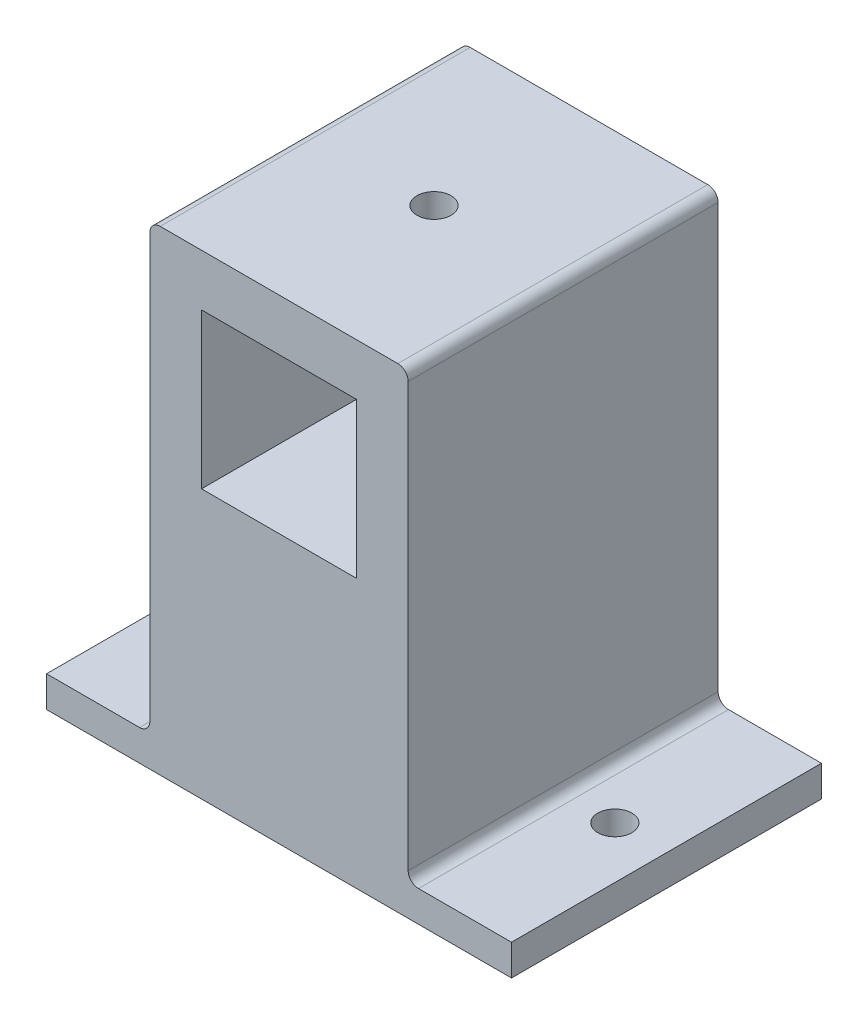
ISO-10303-21;
HEADER;
FILE_DESCRIPTION(('STEP AP214'),'2;1');
FILE_NAME('part.step','',(''),(''),'','','');
FILE_SCHEMA(('AUTOMOTIVE_DESIGN { 1 0 10303 214 1 1 1 1 }'));
ENDSEC;
DATA;
#1=APPLICATION_CONTEXT('core data for automotive mechanical design processes');
#2=APPLICATION_PROTOCOL_DEFINITION('international standard','automotive_design',2000,#1);
#3=PRODUCT_CONTEXT('',#1,'mechanical');
#4=PRODUCT('Part','Part','',(#3));
#5=PRODUCT_RELATED_PRODUCT_CATEGORY('part','',(#4));
#6=PRODUCT_DEFINITION_FORMATION('','',#4);
#7=PRODUCT_DEFINITION_CONTEXT('part definition',#1,'design');
#8=PRODUCT_DEFINITION('design','',#6,#7);
#9=PRODUCT_DEFINITION_SHAPE('','',#8);
#10=(LENGTH_UNIT() NAMED_UNIT(*) SI_UNIT(.MILLI.,.METRE.));
#11=(NAMED_UNIT(*) PLANE_ANGLE_UNIT() SI_UNIT($,.RADIAN.));
#12=(NAMED_UNIT(*) SI_UNIT($,.STERADIAN.) SOLID_ANGLE_UNIT());
#13=UNCERTAINTY_MEASURE_WITH_UNIT(LENGTH_MEASURE(1.E-05),#10,'distance_accuracy_value','');
#14=(GEOMETRIC_REPRESENTATION_CONTEXT(3) GLOBAL_UNCERTAINTY_ASSIGNED_CONTEXT((#13)) GLOBAL_UNIT_ASSIGNED_CONTEXT((#10,
#11,#12)) REPRESENTATION_CONTEXT('',''));
#15=CARTESIAN_POINT('',(0.,0.,0.));
#16=DIRECTION('',(0.,0.,1.));
#17=DIRECTION('',(1.,0.,0.));
#18=AXIS2_PLACEMENT_3D('',#15,#16,#17);
#19=CARTESIAN_POINT('',(0.,0.,30.));
#20=DIRECTION('',(0.,0.,-1.));
#21=DIRECTION('',(-1.,0.,0.));
#22=AXIS2_PLACEMENT_3D('',#19,#20,#21);
#23=PLANE('',#22);
#24=DIRECTION('',(0.,1.,0.));
#25=VECTOR('',#24,1.);
#26=CARTESIAN_POINT('',(12.5,-12.5,30.));
#27=LINE('',#26,#25);
#28=CARTESIAN_POINT('',(12.5,-29.5,30.));
#29=VERTEX_POINT('',#28);
#30=CARTESIAN_POINT('',(12.5,11.5,30.));
#31=VERTEX_POINT('',#30);
#32=EDGE_CURVE('E266',#29,#31,#27,.T.);
#33=ORIENTED_EDGE('',*,*,#32,.T.);
#34=CARTESIAN_POINT('',(11.5,11.5,30.));
#35=DIRECTION('',(0.,0.,-1.));
#36=DIRECTION('',(-1.,0.,0.));
#37=AXIS2_PLACEMENT_3D('',#34,#35,#36);
#38=CIRCLE('',#37,1.);
#39=CARTESIAN_POINT('',(11.5,12.5,30.));
#40=VERTEX_POINT('',#39);
#41=EDGE_CURVE('E322',#31,#40,#38,.F.);
#42=ORIENTED_EDGE('',*,*,#41,.T.);
#43=DIRECTION('',(-1.,0.,0.));
#44=VECTOR('',#43,1.);
#45=CARTESIAN_POINT('',(-12.5,12.5,30.));
#46=LINE('',#45,#44);
#47=CARTESIAN_POINT('',(-11.5,12.5,30.));
#48=VERTEX_POINT('',#47);
#49=EDGE_CURVE('E269',#40,#48,#46,.T.);
#50=ORIENTED_EDGE('',*,*,#49,.T.);
#51=CARTESIAN_POINT('',(-11.5,11.5,30.));
#52=DIRECTION('',(0.,0.,-1.));
#53=DIRECTION('',(-1.,0.,0.));
#54=AXIS2_PLACEMENT_3D('',#51,#52,#53);
#55=CIRCLE('',#54,1.);
#56=CARTESIAN_POINT('',(-12.5,11.5,30.));
#57=VERTEX_POINT('',#56);
#58=EDGE_CURVE('E321',#48,#57,#55,.F.);
#59=ORIENTED_EDGE('',*,*,#58,.T.);
#60=DIRECTION('',(0.,-1.,0.));
#61=VECTOR('',#60,1.);
#62=CARTESIAN_POINT('',(-12.5,-12.5,30.));
#63=LINE('',#62,#61);
#64=CARTESIAN_POINT('',(-12.5,-29.5,30.));
#65=VERTEX_POINT('',#64);
#66=EDGE_CURVE('E274',#57,#65,#63,.T.);
#67=ORIENTED_EDGE('',*,*,#66,.T.);
#68=CARTESIAN_POINT('',(-13.5,-29.5,30.));
#69=DIRECTION('',(0.,0.,-1.));
#70=DIRECTION('',(-1.,0.,0.));
#71=AXIS2_PLACEMENT_3D('',#68,#69,#70);
#72=CIRCLE('',#71,1.);
#73=CARTESIAN_POINT('',(-13.5,-30.5,30.));
#74=VERTEX_POINT('',#73);
#75=EDGE_CURVE('E54',#65,#74,#72,.T.);
#76=ORIENTED_EDGE('',*,*,#75,.T.);
#77=DIRECTION('',(1.,0.,0.));
#78=VECTOR('',#77,1.);
#79=CARTESIAN_POINT('',(0.,-30.5,30.));
#80=LINE('',#79,#78);
#81=CARTESIAN_POINT('',(-22.5,-30.5,30.));
#82=VERTEX_POINT('',#81);
#83=EDGE_CURVE('E197',#82,#74,#80,.T.);
#84=ORIENTED_EDGE('',*,*,#83,.F.);
#85=DIRECTION('',(0.,-1.,0.));
#86=VECTOR('',#85,1.);
#87=CARTESIAN_POINT('',(-22.5,0.,30.));
#88=LINE('',#87,#86);
#89=CARTESIAN_POINT('',(-22.5,-33.5,30.));
#90=VERTEX_POINT('',#89);
#91=EDGE_CURVE('E164',#82,#90,#88,.T.);
#92=ORIENTED_EDGE('',*,*,#91,.T.);
#93=DIRECTION('',(1.,0.,0.));
#94=VECTOR('',#93,1.);
#95=CARTESIAN_POINT('',(0.,-33.5,30.));
#96=LINE('',#95,#94);
#97=CARTESIAN_POINT('',(22.5,-33.5,30.));
#98=VERTEX_POINT('',#97);
#99=EDGE_CURVE('E201',#90,#98,#96,.T.);
#100=ORIENTED_EDGE('',*,*,#99,.T.);
#101=DIRECTION('',(0.,-1.,0.));
#102=VECTOR('',#101,1.);
#103=CARTESIAN_POINT('',(22.5,0.,30.));
#104=LINE('',#103,#102);
#105=CARTESIAN_POINT('',(22.5,-30.5,30.));
#106=VERTEX_POINT('',#105);
#107=EDGE_CURVE('E210',#106,#98,#104,.T.);
#108=ORIENTED_EDGE('',*,*,#107,.F.);
#109=DIRECTION('',(1.,0.,0.));
#110=VECTOR('',#109,1.);
#111=CARTESIAN_POINT('',(0.,-30.5,30.));
#112=LINE('',#111,#110);
#113=CARTESIAN_POINT('',(13.5,-30.5,30.));
#114=VERTEX_POINT('',#113);
#115=EDGE_CURVE('E179',#114,#106,#112,.T.);
#116=ORIENTED_EDGE('',*,*,#115,.F.);
#117=CARTESIAN_POINT('',(13.5,-29.5,30.));
#118=DIRECTION('',(0.,0.,-1.));
#119=DIRECTION('',(-1.,0.,0.));
#120=AXIS2_PLACEMENT_3D('',#117,#118,#119);
#121=CIRCLE('',#120,1.);
#122=EDGE_CURVE('E337',#114,#29,#121,.T.);
#123=ORIENTED_EDGE('',*,*,#122,.T.);
#124=EDGE_LOOP('',(#33,#42,#50,#59,#67,#76,#84,#92,#100,#108,#116,#123));
#125=FACE_BOUND('',#124,.T.);
#126=DIRECTION('',(0.,1.,0.));
#127=VECTOR('',#126,1.);
#128=CARTESIAN_POINT('',(7.5,-7.5,30.));
#129=LINE('',#128,#127);
#130=CARTESIAN_POINT('',(7.5,-7.5,30.));
#131=VERTEX_POINT('',#130);
#132=CARTESIAN_POINT('',(7.5,7.5,30.));
#133=VERTEX_POINT('',#132);
#134=EDGE_CURVE('E224',#131,#133,#129,.T.);
#135=ORIENTED_EDGE('',*,*,#134,.F.);
#136=DIRECTION('',(1.,0.,0.));
#137=VECTOR('',#136,1.);
#138=CARTESIAN_POINT('',(-7.5,-7.5,30.));
#139=LINE('',#138,#137);
#140=CARTESIAN_POINT('',(-7.5,-7.5,30.));
#141=VERTEX_POINT('',#140);
#142=EDGE_CURVE('E231',#141,#131,#139,.T.);
#143=ORIENTED_EDGE('',*,*,#142,.F.);
#144=DIRECTION('',(0.,-1.,0.));
#145=VECTOR('',#144,1.);
#146=CARTESIAN_POINT('',(-7.5,-7.5,30.));
#147=LINE('',#146,#145);
#148=CARTESIAN_POINT('',(-7.5,7.5,30.));
#149=VERTEX_POINT('',#148);
#150=EDGE_CURVE('E226',#149,#141,#147,.T.);
#151=ORIENTED_EDGE('',*,*,#150,.F.);
#152=DIRECTION('',(-1.,0.,0.));
#153=VECTOR('',#152,1.);
#154=CARTESIAN_POINT('',(-7.5,7.5,30.));
#155=LINE('',#154,#153);
#156=EDGE_CURVE('E227',#133,#149,#155,.T.);
#157=ORIENTED_EDGE('',*,*,#156,.F.);
#158=EDGE_LOOP('',(#135,#143,#151,#157));
#159=FACE_BOUND('',#158,.T.);
#160=ADVANCED_FACE('F46',(#125,#159),#23,.F.);
#161=CARTESIAN_POINT('',(0.,0.,0.));
#162=DIRECTION('',(0.,0.,-1.));
#163=DIRECTION('',(-1.,0.,0.));
#164=AXIS2_PLACEMENT_3D('',#161,#162,#163);
#165=PLANE('',#164);
#166=DIRECTION('',(-1.,0.,0.));
#167=VECTOR('',#166,1.);
#168=CARTESIAN_POINT('',(-12.5,12.5,0.));
#169=LINE('',#168,#167);
#170=CARTESIAN_POINT('',(11.5,12.5,0.));
#171=VERTEX_POINT('',#170);
#172=CARTESIAN_POINT('',(-11.5,12.5,0.));
#173=VERTEX_POINT('',#172);
#174=EDGE_CURVE('E285',#171,#173,#169,.T.);
#175=ORIENTED_EDGE('',*,*,#174,.F.);
#176=CARTESIAN_POINT('',(11.5,11.5,0.));
#177=DIRECTION('',(0.,0.,-1.));
#178=DIRECTION('',(-1.,0.,0.));
#179=AXIS2_PLACEMENT_3D('',#176,#177,#178);
#180=CIRCLE('',#179,1.);
#181=CARTESIAN_POINT('',(12.5,11.5,0.));
#182=VERTEX_POINT('',#181);
#183=EDGE_CURVE('E318',#171,#182,#180,.T.);
#184=ORIENTED_EDGE('',*,*,#183,.T.);
#185=DIRECTION('',(0.,1.,0.));
#186=VECTOR('',#185,1.);
#187=CARTESIAN_POINT('',(12.5,-12.5,0.));
#188=LINE('',#187,#186);
#189=CARTESIAN_POINT('',(12.5,-29.5,0.));
#190=VERTEX_POINT('',#189);
#191=EDGE_CURVE('E264',#190,#182,#188,.T.);
#192=ORIENTED_EDGE('',*,*,#191,.F.);
#193=CARTESIAN_POINT('',(13.5,-29.5,0.));
#194=DIRECTION('',(0.,0.,-1.));
#195=DIRECTION('',(-1.,0.,0.));
#196=AXIS2_PLACEMENT_3D('',#193,#194,#195);
#197=CIRCLE('',#196,1.);
#198=CARTESIAN_POINT('',(13.5,-30.5,0.));
#199=VERTEX_POINT('',#198);
#200=EDGE_CURVE('E339',#190,#199,#197,.F.);
#201=ORIENTED_EDGE('',*,*,#200,.T.);
#202=DIRECTION('',(1.,0.,0.));
#203=VECTOR('',#202,1.);
#204=CARTESIAN_POINT('',(0.,-30.5,0.));
#205=LINE('',#204,#203);
#206=CARTESIAN_POINT('',(22.5,-30.5,0.));
#207=VERTEX_POINT('',#206);
#208=EDGE_CURVE('E166',#199,#207,#205,.T.);
#209=ORIENTED_EDGE('',*,*,#208,.T.);
#210=DIRECTION('',(0.,-1.,0.));
#211=VECTOR('',#210,1.);
#212=CARTESIAN_POINT('',(22.5,0.,0.));
#213=LINE('',#212,#211);
#214=CARTESIAN_POINT('',(22.5,-33.5,0.));
#215=VERTEX_POINT('',#214);
#216=EDGE_CURVE('E189',#207,#215,#213,.T.);
#217=ORIENTED_EDGE('',*,*,#216,.T.);
#218=DIRECTION('',(1.,0.,0.));
#219=VECTOR('',#218,1.);
#220=CARTESIAN_POINT('',(0.,-33.5,0.));
#221=LINE('',#220,#219);
#222=CARTESIAN_POINT('',(-22.5,-33.5,0.));
#223=VERTEX_POINT('',#222);
#224=EDGE_CURVE('E183',#223,#215,#221,.T.);
#225=ORIENTED_EDGE('',*,*,#224,.F.);
#226=DIRECTION('',(0.,-1.,0.));
#227=VECTOR('',#226,1.);
#228=CARTESIAN_POINT('',(-22.5,0.,0.));
#229=LINE('',#228,#227);
#230=CARTESIAN_POINT('',(-22.5,-30.5,0.));
#231=VERTEX_POINT('',#230);
#232=EDGE_CURVE('E162',#231,#223,#229,.T.);
#233=ORIENTED_EDGE('',*,*,#232,.F.);
#234=DIRECTION('',(1.,0.,0.));
#235=VECTOR('',#234,1.);
#236=CARTESIAN_POINT('',(0.,-30.5,0.));
#237=LINE('',#236,#235);
#238=CARTESIAN_POINT('',(-13.5,-30.5,0.));
#239=VERTEX_POINT('',#238);
#240=EDGE_CURVE('E175',#231,#239,#237,.T.);
#241=ORIENTED_EDGE('',*,*,#240,.T.);
#242=CARTESIAN_POINT('',(-13.5,-29.5,0.));
#243=DIRECTION('',(0.,0.,-1.));
#244=DIRECTION('',(-1.,0.,0.));
#245=AXIS2_PLACEMENT_3D('',#242,#243,#244);
#246=CIRCLE('',#245,1.);
#247=CARTESIAN_POINT('',(-12.5,-29.5,0.));
#248=VERTEX_POINT('',#247);
#249=EDGE_CURVE('E11',#239,#248,#246,.F.);
#250=ORIENTED_EDGE('',*,*,#249,.T.);
#251=DIRECTION('',(0.,-1.,0.));
#252=VECTOR('',#251,1.);
#253=CARTESIAN_POINT('',(-12.5,-12.5,0.));
#254=LINE('',#253,#252);
#255=CARTESIAN_POINT('',(-12.5,11.5,0.));
#256=VERTEX_POINT('',#255);
#257=EDGE_CURVE('E271',#256,#248,#254,.T.);
#258=ORIENTED_EDGE('',*,*,#257,.F.);
#259=CARTESIAN_POINT('',(-11.5,11.5,0.));
#260=DIRECTION('',(0.,0.,-1.));
#261=DIRECTION('',(-1.,0.,0.));
#262=AXIS2_PLACEMENT_3D('',#259,#260,#261);
#263=CIRCLE('',#262,1.);
#264=EDGE_CURVE('E312',#256,#173,#263,.T.);
#265=ORIENTED_EDGE('',*,*,#264,.T.);
#266=EDGE_LOOP('',(#175,#184,#192,#201,#209,#217,#225,#233,#241,#250,#258,#265));
#267=FACE_BOUND('',#266,.T.);
#268=DIRECTION('',(1.,0.,0.));
#269=VECTOR('',#268,1.);
#270=CARTESIAN_POINT('',(-7.5,-7.5,0.));
#271=LINE('',#270,#269);
#272=CARTESIAN_POINT('',(-7.5,-7.5,0.));
#273=VERTEX_POINT('',#272);
#274=CARTESIAN_POINT('',(7.5,-7.5,0.));
#275=VERTEX_POINT('',#274);
#276=EDGE_CURVE('E230',#273,#275,#271,.T.);
#277=ORIENTED_EDGE('',*,*,#276,.T.);
#278=DIRECTION('',(0.,1.,0.));
#279=VECTOR('',#278,1.);
#280=CARTESIAN_POINT('',(7.5,-7.5,0.));
#281=LINE('',#280,#279);
#282=CARTESIAN_POINT('',(7.5,7.5,0.));
#283=VERTEX_POINT('',#282);
#284=EDGE_CURVE('E220',#275,#283,#281,.T.);
#285=ORIENTED_EDGE('',*,*,#284,.T.);
#286=DIRECTION('',(-1.,0.,0.));
#287=VECTOR('',#286,1.);
#288=CARTESIAN_POINT('',(-7.5,7.5,0.));
#289=LINE('',#288,#287);
#290=CARTESIAN_POINT('',(-7.5,7.5,0.));
#291=VERTEX_POINT('',#290);
#292=EDGE_CURVE('E242',#283,#291,#289,.T.);
#293=ORIENTED_EDGE('',*,*,#292,.T.);
#294=DIRECTION('',(0.,-1.,0.));
#295=VECTOR('',#294,1.);
#296=CARTESIAN_POINT('',(-7.5,-7.5,0.));
#297=LINE('',#296,#295);
#298=EDGE_CURVE('E241',#291,#273,#297,.T.);
#299=ORIENTED_EDGE('',*,*,#298,.T.);
#300=EDGE_LOOP('',(#277,#285,#293,#299));
#301=FACE_BOUND('',#300,.T.);
#302=ADVANCED_FACE('F185',(#267,#301),#165,.T.);
#303=CARTESIAN_POINT('',(12.5,-12.5,30.));
#304=DIRECTION('',(-1.,0.,0.));
#305=DIRECTION('',(0.,0.,1.));
#306=AXIS2_PLACEMENT_3D('',#303,#304,#305);
#307=PLANE('',#306);
#308=ORIENTED_EDGE('',*,*,#32,.F.);
#309=DIRECTION('',(0.,0.,1.));
#310=VECTOR('',#309,1.);
#311=CARTESIAN_POINT('',(12.5,-29.5,0.));
#312=LINE('',#311,#310);
#313=EDGE_CURVE('E303',#29,#190,#312,.F.);
#314=ORIENTED_EDGE('',*,*,#313,.T.);
#315=ORIENTED_EDGE('',*,*,#191,.T.);
#316=DIRECTION('',(0.,0.,-1.));
#317=VECTOR('',#316,1.);
#318=CARTESIAN_POINT('',(12.5,11.5,30.));
#319=LINE('',#318,#317);
#320=EDGE_CURVE('E305',#182,#31,#319,.F.);
#321=ORIENTED_EDGE('',*,*,#320,.T.);
#322=EDGE_LOOP('',(#308,#314,#315,#321));
#323=FACE_BOUND('',#322,.T.);
#324=ADVANCED_FACE('F356',(#323),#307,.F.);
#325=CARTESIAN_POINT('',(-12.5,12.5,30.));
#326=DIRECTION('',(0.,-1.,0.));
#327=DIRECTION('',(0.,0.,-1.));
#328=AXIS2_PLACEMENT_3D('',#325,#326,#327);
#329=PLANE('',#328);
#330=CARTESIAN_POINT('',(0.,12.5,15.));
#331=DIRECTION('',(0.,1.,0.));
#332=DIRECTION('',(0.,0.,1.));
#333=AXIS2_PLACEMENT_3D('',#330,#331,#332);
#334=CIRCLE('',#333,1.65);
#335=CARTESIAN_POINT('',(0.,12.5,16.65));
#336=VERTEX_POINT('',#335);
#337=EDGE_CURVE('E298',#336,#336,#334,.T.);
#338=ORIENTED_EDGE('',*,*,#337,.F.);
#339=EDGE_LOOP('',(#338));
#340=FACE_BOUND('',#339,.T.);
#341=ORIENTED_EDGE('',*,*,#49,.F.);
#342=DIRECTION('',(0.,0.,-1.));
#343=VECTOR('',#342,1.);
#344=CARTESIAN_POINT('',(11.5,12.5,30.));
#345=LINE('',#344,#343);
#346=EDGE_CURVE('E313',#40,#171,#345,.T.);
#347=ORIENTED_EDGE('',*,*,#346,.T.);
#348=ORIENTED_EDGE('',*,*,#174,.T.);
#349=DIRECTION('',(0.,0.,-1.));
#350=VECTOR('',#349,1.);
#351=CARTESIAN_POINT('',(-11.5,12.5,30.));
#352=LINE('',#351,#350);
#353=EDGE_CURVE('E306',#173,#48,#352,.F.);
#354=ORIENTED_EDGE('',*,*,#353,.T.);
#355=EDGE_LOOP('',(#341,#347,#348,#354));
#356=FACE_BOUND('',#355,.T.);
#357=ADVANCED_FACE('F370',(#340,#356),#329,.F.);
#358=CARTESIAN_POINT('',(-12.5,-12.5,30.));
#359=DIRECTION('',(1.,0.,0.));
#360=DIRECTION('',(0.,0.,-1.));
#361=AXIS2_PLACEMENT_3D('',#358,#359,#360);
#362=PLANE('',#361);
#363=ORIENTED_EDGE('',*,*,#66,.F.);
#364=DIRECTION('',(0.,0.,-1.));
#365=VECTOR('',#364,1.);
#366=CARTESIAN_POINT('',(-12.5,11.5,30.));
#367=LINE('',#366,#365);
#368=EDGE_CURVE('E329',#57,#256,#367,.T.);
#369=ORIENTED_EDGE('',*,*,#368,.T.);
#370=ORIENTED_EDGE('',*,*,#257,.T.);
#371=DIRECTION('',(0.,0.,1.));
#372=VECTOR('',#371,1.);
#373=CARTESIAN_POINT('',(-12.5,-29.5,30.));
#374=LINE('',#373,#372);
#375=EDGE_CURVE('E330',#248,#65,#374,.T.);
#376=ORIENTED_EDGE('',*,*,#375,.T.);
#377=EDGE_LOOP('',(#363,#369,#370,#376));
#378=FACE_BOUND('',#377,.T.);
#379=ADVANCED_FACE('F372',(#378),#362,.F.);
#380=CARTESIAN_POINT('',(7.5,-7.5,30.));
#381=DIRECTION('',(-1.,0.,0.));
#382=DIRECTION('',(0.,0.,1.));
#383=AXIS2_PLACEMENT_3D('',#380,#381,#382);
#384=PLANE('',#383);
#385=ORIENTED_EDGE('',*,*,#284,.F.);
#386=DIRECTION('',(0.,0.,-1.));
#387=VECTOR('',#386,1.);
#388=CARTESIAN_POINT('',(7.5,-7.5,30.));
#389=LINE('',#388,#387);
#390=EDGE_CURVE('E240',#131,#275,#389,.T.);
#391=ORIENTED_EDGE('',*,*,#390,.F.);
#392=ORIENTED_EDGE('',*,*,#134,.T.);
#393=DIRECTION('',(0.,0.,-1.));
#394=VECTOR('',#393,1.);
#395=CARTESIAN_POINT('',(7.5,7.5,30.));
#396=LINE('',#395,#394);
#397=EDGE_CURVE('E261',#133,#283,#396,.T.);
#398=ORIENTED_EDGE('',*,*,#397,.T.);
#399=EDGE_LOOP('',(#385,#391,#392,#398));
#400=FACE_BOUND('',#399,.T.);
#401=ADVANCED_FACE('F389',(#400),#384,.T.);
#402=CARTESIAN_POINT('',(-7.5,7.5,30.));
#403=DIRECTION('',(0.,-1.,0.));
#404=DIRECTION('',(0.,0.,-1.));
#405=AXIS2_PLACEMENT_3D('',#402,#403,#404);
#406=PLANE('',#405);
#407=CARTESIAN_POINT('',(0.,7.49999999999995,15.));
#408=DIRECTION('',(0.,-1.,0.));
#409=DIRECTION('',(0.,0.,-1.));
#410=AXIS2_PLACEMENT_3D('',#407,#408,#409);
#411=CIRCLE('',#410,1.65);
#412=CARTESIAN_POINT('',(0.,7.49999999999995,13.35));
#413=VERTEX_POINT('',#412);
#414=EDGE_CURVE('E619',#413,#413,#411,.T.);
#415=ORIENTED_EDGE('',*,*,#414,.F.);
#416=EDGE_LOOP('',(#415));
#417=FACE_BOUND('',#416,.T.);
#418=ORIENTED_EDGE('',*,*,#292,.F.);
#419=ORIENTED_EDGE('',*,*,#397,.F.);
#420=ORIENTED_EDGE('',*,*,#156,.T.);
#421=DIRECTION('',(0.,0.,-1.));
#422=VECTOR('',#421,1.);
#423=CARTESIAN_POINT('',(-7.5,7.5,30.));
#424=LINE('',#423,#422);
#425=EDGE_CURVE('E256',#149,#291,#424,.T.);
#426=ORIENTED_EDGE('',*,*,#425,.T.);
#427=EDGE_LOOP('',(#418,#419,#420,#426));
#428=FACE_BOUND('',#427,.T.);
#429=ADVANCED_FACE('F517',(#417,#428),#406,.T.);
#430=CARTESIAN_POINT('',(-7.5,-7.5,30.));
#431=DIRECTION('',(1.,0.,0.));
#432=DIRECTION('',(0.,0.,-1.));
#433=AXIS2_PLACEMENT_3D('',#430,#431,#432);
#434=PLANE('',#433);
#435=ORIENTED_EDGE('',*,*,#298,.F.);
#436=ORIENTED_EDGE('',*,*,#425,.F.);
#437=ORIENTED_EDGE('',*,*,#150,.T.);
#438=DIRECTION('',(0.,0.,-1.));
#439=VECTOR('',#438,1.);
#440=CARTESIAN_POINT('',(-7.5,-7.5,30.));
#441=LINE('',#440,#439);
#442=EDGE_CURVE('E254',#141,#273,#441,.T.);
#443=ORIENTED_EDGE('',*,*,#442,.T.);
#444=EDGE_LOOP('',(#435,#436,#437,#443));
#445=FACE_BOUND('',#444,.T.);
#446=ADVANCED_FACE('F507',(#445),#434,.T.);
#447=CARTESIAN_POINT('',(-7.5,-7.5,30.));
#448=DIRECTION('',(0.,1.,0.));
#449=DIRECTION('',(0.,0.,1.));
#450=AXIS2_PLACEMENT_3D('',#447,#448,#449);
#451=PLANE('',#450);
#452=CARTESIAN_POINT('',(0.,-7.49999999999995,15.));
#453=DIRECTION('',(0.,1.,0.));
#454=DIRECTION('',(0.,0.,1.));
#455=AXIS2_PLACEMENT_3D('',#452,#453,#454);
#456=CIRCLE('',#455,1.65);
#457=CARTESIAN_POINT('',(0.,-7.49999999999995,16.65));
#458=VERTEX_POINT('',#457);
#459=EDGE_CURVE('E300',#458,#458,#456,.T.);
#460=ORIENTED_EDGE('',*,*,#459,.F.);
#461=EDGE_LOOP('',(#460));
#462=FACE_BOUND('',#461,.T.);
#463=ORIENTED_EDGE('',*,*,#276,.F.);
#464=ORIENTED_EDGE('',*,*,#442,.F.);
#465=ORIENTED_EDGE('',*,*,#142,.T.);
#466=ORIENTED_EDGE('',*,*,#390,.T.);
#467=EDGE_LOOP('',(#463,#464,#465,#466));
#468=FACE_BOUND('',#467,.T.);
#469=ADVANCED_FACE('F497',(#462,#468),#451,.T.);
#470=CARTESIAN_POINT('',(0.,-30.5,0.));
#471=DIRECTION('',(0.,-1.,0.));
#472=DIRECTION('',(1.,0.,0.));
#473=AXIS2_PLACEMENT_3D('',#470,#471,#472);
#474=PLANE('',#473);
#475=CARTESIAN_POINT('',(17.5,-30.5,15.));
#476=DIRECTION('',(0.,1.,0.));
#477=DIRECTION('',(0.,0.,1.));
#478=AXIS2_PLACEMENT_3D('',#475,#476,#477);
#479=CIRCLE('',#478,1.65);
#480=CARTESIAN_POINT('',(17.5,-30.5,16.65));
#481=VERTEX_POINT('',#480);
#482=EDGE_CURVE('E295',#481,#481,#479,.T.);
#483=ORIENTED_EDGE('',*,*,#482,.F.);
#484=EDGE_LOOP('',(#483));
#485=FACE_BOUND('',#484,.T.);
#486=ORIENTED_EDGE('',*,*,#208,.F.);
#487=DIRECTION('',(0.,0.,1.));
#488=VECTOR('',#487,1.);
#489=CARTESIAN_POINT('',(13.5,-30.5,30.));
#490=LINE('',#489,#488);
#491=EDGE_CURVE('E279',#199,#114,#490,.T.);
#492=ORIENTED_EDGE('',*,*,#491,.T.);
#493=ORIENTED_EDGE('',*,*,#115,.T.);
#494=DIRECTION('',(0.,0.,1.));
#495=VECTOR('',#494,1.);
#496=CARTESIAN_POINT('',(22.5,-30.5,0.));
#497=LINE('',#496,#495);
#498=EDGE_CURVE('E213',#207,#106,#497,.T.);
#499=ORIENTED_EDGE('',*,*,#498,.F.);
#500=EDGE_LOOP('',(#486,#492,#493,#499));
#501=FACE_BOUND('',#500,.T.);
#502=ADVANCED_FACE('F348',(#485,#501),#474,.F.);
#503=CARTESIAN_POINT('',(22.5,0.,0.));
#504=DIRECTION('',(-1.,0.,0.));
#505=DIRECTION('',(0.,0.,1.));
#506=AXIS2_PLACEMENT_3D('',#503,#504,#505);
#507=PLANE('',#506);
#508=ORIENTED_EDGE('',*,*,#107,.T.);
#509=DIRECTION('',(0.,0.,1.));
#510=VECTOR('',#509,1.);
#511=CARTESIAN_POINT('',(22.5,-33.5,0.));
#512=LINE('',#511,#510);
#513=EDGE_CURVE('E217',#215,#98,#512,.T.);
#514=ORIENTED_EDGE('',*,*,#513,.F.);
#515=ORIENTED_EDGE('',*,*,#216,.F.);
#516=ORIENTED_EDGE('',*,*,#498,.T.);
#517=EDGE_LOOP('',(#508,#514,#515,#516));
#518=FACE_BOUND('',#517,.T.);
#519=ADVANCED_FACE('F479',(#518),#507,.F.);
#520=CARTESIAN_POINT('',(0.,-33.5,0.));
#521=DIRECTION('',(0.,-1.,0.));
#522=DIRECTION('',(0.,0.,-1.));
#523=AXIS2_PLACEMENT_3D('',#520,#521,#522);
#524=PLANE('',#523);
#525=CARTESIAN_POINT('',(0.,-33.5,15.));
#526=DIRECTION('',(0.,-1.,0.));
#527=DIRECTION('',(0.,0.,-1.));
#528=AXIS2_PLACEMENT_3D('',#525,#526,#527);
#529=CIRCLE('',#528,1.65);
#530=CARTESIAN_POINT('',(0.,-33.5,13.35));
#531=VERTEX_POINT('',#530);
#532=EDGE_CURVE('E291',#531,#531,#529,.T.);
#533=ORIENTED_EDGE('',*,*,#532,.F.);
#534=EDGE_LOOP('',(#533));
#535=FACE_BOUND('',#534,.T.);
#536=CARTESIAN_POINT('',(-17.5,-33.5,15.));
#537=DIRECTION('',(0.,-1.,0.));
#538=DIRECTION('',(0.,0.,-1.));
#539=AXIS2_PLACEMENT_3D('',#536,#537,#538);
#540=CIRCLE('',#539,1.65);
#541=CARTESIAN_POINT('',(-17.5,-33.5,13.35));
#542=VERTEX_POINT('',#541);
#543=EDGE_CURVE('E623',#542,#542,#540,.F.);
#544=ORIENTED_EDGE('',*,*,#543,.T.);
#545=EDGE_LOOP('',(#544));
#546=FACE_BOUND('',#545,.T.);
#547=CARTESIAN_POINT('',(17.5,-33.5,15.));
#548=DIRECTION('',(0.,-1.,0.));
#549=DIRECTION('',(0.,0.,-1.));
#550=AXIS2_PLACEMENT_3D('',#547,#548,#549);
#551=CIRCLE('',#550,1.65);
#552=CARTESIAN_POINT('',(17.5,-33.5,13.35));
#553=VERTEX_POINT('',#552);
#554=EDGE_CURVE('E199',#553,#553,#551,.T.);
#555=ORIENTED_EDGE('',*,*,#554,.F.);
#556=EDGE_LOOP('',(#555));
#557=FACE_BOUND('',#556,.T.);
#558=ORIENTED_EDGE('',*,*,#99,.F.);
#559=DIRECTION('',(0.,0.,1.));
#560=VECTOR('',#559,1.);
#561=CARTESIAN_POINT('',(-22.5,-33.5,0.));
#562=LINE('',#561,#560);
#563=EDGE_CURVE('E169',#223,#90,#562,.T.);
#564=ORIENTED_EDGE('',*,*,#563,.F.);
#565=ORIENTED_EDGE('',*,*,#224,.T.);
#566=ORIENTED_EDGE('',*,*,#513,.T.);
#567=EDGE_LOOP('',(#558,#564,#565,#566));
#568=FACE_BOUND('',#567,.T.);
#569=ADVANCED_FACE('F468',(#535,#546,#557,#568),#524,.T.);
#570=CARTESIAN_POINT('',(-22.5,0.,0.));
#571=DIRECTION('',(-1.,0.,0.));
#572=DIRECTION('',(0.,0.,1.));
#573=AXIS2_PLACEMENT_3D('',#570,#571,#572);
#574=PLANE('',#573);
#575=ORIENTED_EDGE('',*,*,#91,.F.);
#576=DIRECTION('',(0.,0.,1.));
#577=VECTOR('',#576,1.);
#578=CARTESIAN_POINT('',(-22.5,-30.5,0.));
#579=LINE('',#578,#577);
#580=EDGE_CURVE('E157',#231,#82,#579,.T.);
#581=ORIENTED_EDGE('',*,*,#580,.F.);
#582=ORIENTED_EDGE('',*,*,#232,.T.);
#583=ORIENTED_EDGE('',*,*,#563,.T.);
#584=EDGE_LOOP('',(#575,#581,#582,#583));
#585=FACE_BOUND('',#584,.T.);
#586=ADVANCED_FACE('F161',(#585),#574,.T.);
#587=CARTESIAN_POINT('',(0.,-30.5,0.));
#588=DIRECTION('',(0.,-1.,0.));
#589=DIRECTION('',(1.,0.,0.));
#590=AXIS2_PLACEMENT_3D('',#587,#588,#589);
#591=PLANE('',#590);
#592=CARTESIAN_POINT('',(-17.5,-30.5,15.));
#593=DIRECTION('',(0.,-1.,0.));
#594=DIRECTION('',(0.,0.,1.));
#595=AXIS2_PLACEMENT_3D('',#592,#593,#594);
#596=CIRCLE('',#595,1.65);
#597=CARTESIAN_POINT('',(-17.5,-30.5,16.65));
#598=VERTEX_POINT('',#597);
#599=EDGE_CURVE('E618',#598,#598,#596,.T.);
#600=ORIENTED_EDGE('',*,*,#599,.T.);
#601=EDGE_LOOP('',(#600));
#602=FACE_BOUND('',#601,.T.);
#603=ORIENTED_EDGE('',*,*,#83,.T.);
#604=DIRECTION('',(0.,0.,1.));
#605=VECTOR('',#604,1.);
#606=CARTESIAN_POINT('',(-13.5,-30.5,0.));
#607=LINE('',#606,#605);
#608=EDGE_CURVE('E174',#74,#239,#607,.F.);
#609=ORIENTED_EDGE('',*,*,#608,.T.);
#610=ORIENTED_EDGE('',*,*,#240,.F.);
#611=ORIENTED_EDGE('',*,*,#580,.T.);
#612=EDGE_LOOP('',(#603,#609,#610,#611));
#613=FACE_BOUND('',#612,.T.);
#614=ADVANCED_FACE('F173',(#602,#613),#591,.F.);
#615=CARTESIAN_POINT('',(17.5,-60.5,15.));
#616=DIRECTION('',(0.,1.,0.));
#617=DIRECTION('',(0.,0.,1.));
#618=AXIS2_PLACEMENT_3D('',#615,#616,#617);
#619=CYLINDRICAL_SURFACE('',#618,1.65);
#620=ORIENTED_EDGE('',*,*,#554,.T.);
#621=EDGE_LOOP('',(#620));
#622=FACE_BOUND('',#621,.T.);
#623=ORIENTED_EDGE('',*,*,#482,.T.);
#624=EDGE_LOOP('',(#623));
#625=FACE_BOUND('',#624,.T.);
#626=ADVANCED_FACE('F447',(#622,#625),#619,.F.);
#627=CARTESIAN_POINT('',(-17.5,-60.5,15.));
#628=DIRECTION('',(0.,1.,0.));
#629=DIRECTION('',(0.,0.,1.));
#630=AXIS2_PLACEMENT_3D('',#627,#628,#629);
#631=CYLINDRICAL_SURFACE('',#630,1.65);
#632=ORIENTED_EDGE('',*,*,#543,.F.);
#633=EDGE_LOOP('',(#632));
#634=FACE_BOUND('',#633,.T.);
#635=ORIENTED_EDGE('',*,*,#599,.F.);
#636=EDGE_LOOP('',(#635));
#637=FACE_BOUND('',#636,.T.);
#638=ADVANCED_FACE('F437',(#634,#637),#631,.F.);
#639=CARTESIAN_POINT('',(0.,-987.5,15.));
#640=DIRECTION('',(0.,1.,0.));
#641=DIRECTION('',(0.,0.,1.));
#642=AXIS2_PLACEMENT_3D('',#639,#640,#641);
#643=CYLINDRICAL_SURFACE('',#642,1.65);
#644=ORIENTED_EDGE('',*,*,#459,.T.);
#645=EDGE_LOOP('',(#644));
#646=FACE_BOUND('',#645,.T.);
#647=ORIENTED_EDGE('',*,*,#532,.T.);
#648=EDGE_LOOP('',(#647));
#649=FACE_BOUND('',#648,.T.);
#650=ADVANCED_FACE('F427',(#646,#649),#643,.F.);
#651=ORIENTED_EDGE('',*,*,#414,.T.);
#652=EDGE_LOOP('',(#651));
#653=FACE_BOUND('',#652,.T.);
#654=ORIENTED_EDGE('',*,*,#337,.T.);
#655=EDGE_LOOP('',(#654));
#656=FACE_BOUND('',#655,.T.);
#657=ADVANCED_FACE('F398',(#653,#656),#643,.F.);
#658=CARTESIAN_POINT('',(13.5,-29.5,0.));
#659=DIRECTION('',(0.,0.,-1.));
#660=DIRECTION('',(-1.,0.,0.));
#661=AXIS2_PLACEMENT_3D('',#658,#659,#660);
#662=CYLINDRICAL_SURFACE('',#661,1.);
#663=ORIENTED_EDGE('',*,*,#200,.F.);
#664=ORIENTED_EDGE('',*,*,#313,.F.);
#665=ORIENTED_EDGE('',*,*,#122,.F.);
#666=ORIENTED_EDGE('',*,*,#491,.F.);
#667=EDGE_LOOP('',(#663,#664,#665,#666));
#668=FACE_BOUND('',#667,.T.);
#669=ADVANCED_FACE('F353',(#668),#662,.F.);
#670=CARTESIAN_POINT('',(11.5,11.5,30.));
#671=DIRECTION('',(0.,0.,-1.));
#672=DIRECTION('',(-1.,0.,0.));
#673=AXIS2_PLACEMENT_3D('',#670,#671,#672);
#674=CYLINDRICAL_SURFACE('',#673,1.);
#675=ORIENTED_EDGE('',*,*,#41,.F.);
#676=ORIENTED_EDGE('',*,*,#320,.F.);
#677=ORIENTED_EDGE('',*,*,#183,.F.);
#678=ORIENTED_EDGE('',*,*,#346,.F.);
#679=EDGE_LOOP('',(#675,#676,#677,#678));
#680=FACE_BOUND('',#679,.T.);
#681=ADVANCED_FACE('F362',(#680),#674,.T.);
#682=CARTESIAN_POINT('',(-11.5,11.5,30.));
#683=DIRECTION('',(0.,0.,-1.));
#684=DIRECTION('',(-1.,0.,0.));
#685=AXIS2_PLACEMENT_3D('',#682,#683,#684);
#686=CYLINDRICAL_SURFACE('',#685,1.);
#687=ORIENTED_EDGE('',*,*,#58,.F.);
#688=ORIENTED_EDGE('',*,*,#353,.F.);
#689=ORIENTED_EDGE('',*,*,#264,.F.);
#690=ORIENTED_EDGE('',*,*,#368,.F.);
#691=EDGE_LOOP('',(#687,#688,#689,#690));
#692=FACE_BOUND('',#691,.T.);
#693=ADVANCED_FACE('F367',(#692),#686,.T.);
#694=CARTESIAN_POINT('',(-13.5,-29.5,30.));
#695=DIRECTION('',(0.,0.,-1.));
#696=DIRECTION('',(-1.,0.,0.));
#697=AXIS2_PLACEMENT_3D('',#694,#695,#696);
#698=CYLINDRICAL_SURFACE('',#697,1.);
#699=ORIENTED_EDGE('',*,*,#249,.F.);
#700=ORIENTED_EDGE('',*,*,#608,.F.);
#701=ORIENTED_EDGE('',*,*,#75,.F.);
#702=ORIENTED_EDGE('',*,*,#375,.F.);
#703=EDGE_LOOP('',(#699,#700,#701,#702));
#704=FACE_BOUND('',#703,.T.);
#705=ADVANCED_FACE('F48',(#704),#698,.F.);
#706=CLOSED_SHELL('',(#160,#302,#324,#357,#379,#401,#429,#446,#469,#502,#519,#569,#586,#614,
#626,#638,#650,#657,#669,#681,#693,#705));
#707=MANIFOLD_SOLID_BREP('B2',#706);
#708=ADVANCED_BREP_SHAPE_REPRESENTATION('',(#18,#707),#14);
#709=SHAPE_DEFINITION_REPRESENTATION(#9,#708);
ENDSEC;
END-ISO-10303-21;
